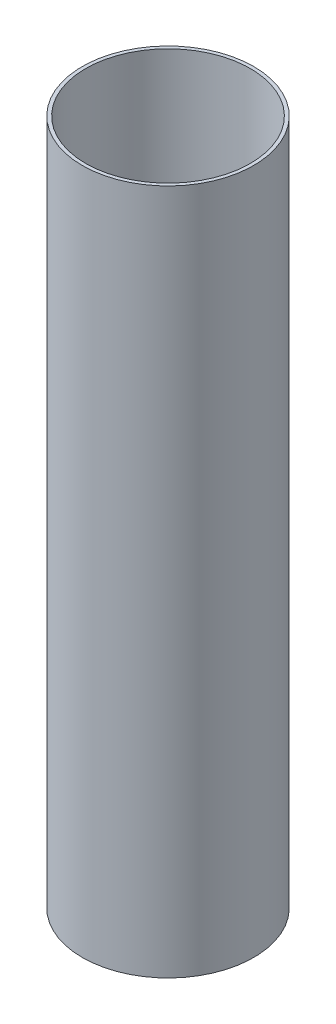
ISO-10303-21;
HEADER;
FILE_DESCRIPTION(('STEP AP214'),'2;1');
FILE_NAME('part.step','',(''),(''),'','','');
FILE_SCHEMA(('AUTOMOTIVE_DESIGN { 1 0 10303 214 1 1 1 1 }'));
ENDSEC;
DATA;
#1=APPLICATION_CONTEXT('core data for automotive mechanical design processes');
#2=APPLICATION_PROTOCOL_DEFINITION('international standard','automotive_design',2000,#1);
#3=PRODUCT_CONTEXT('',#1,'mechanical');
#4=PRODUCT('Part','Part','',(#3));
#5=PRODUCT_RELATED_PRODUCT_CATEGORY('part','',(#4));
#6=PRODUCT_DEFINITION_FORMATION('','',#4);
#7=PRODUCT_DEFINITION_CONTEXT('part definition',#1,'design');
#8=PRODUCT_DEFINITION('design','',#6,#7);
#9=PRODUCT_DEFINITION_SHAPE('','',#8);
#10=(LENGTH_UNIT() NAMED_UNIT(*) SI_UNIT(.MILLI.,.METRE.));
#11=(NAMED_UNIT(*) PLANE_ANGLE_UNIT() SI_UNIT($,.RADIAN.));
#12=(NAMED_UNIT(*) SI_UNIT($,.STERADIAN.) SOLID_ANGLE_UNIT());
#13=UNCERTAINTY_MEASURE_WITH_UNIT(LENGTH_MEASURE(1.E-05),#10,'distance_accuracy_value','');
#14=(GEOMETRIC_REPRESENTATION_CONTEXT(3) GLOBAL_UNCERTAINTY_ASSIGNED_CONTEXT((#13)) GLOBAL_UNIT_ASSIGNED_CONTEXT((#10,
#11,#12)) REPRESENTATION_CONTEXT('',''));
#15=CARTESIAN_POINT('',(0.,0.,0.));
#16=DIRECTION('',(0.,0.,1.));
#17=DIRECTION('',(1.,0.,0.));
#18=AXIS2_PLACEMENT_3D('',#15,#16,#17);
#19=CARTESIAN_POINT('',(0.,400.,0.));
#20=DIRECTION('',(0.,1.,0.));
#21=DIRECTION('',(0.,0.,1.));
#22=AXIS2_PLACEMENT_3D('',#19,#20,#21);
#23=PLANE('',#22);
#24=CARTESIAN_POINT('',(0.,400.,0.));
#25=DIRECTION('',(0.,1.,0.));
#26=DIRECTION('',(0.,0.,1.));
#27=AXIS2_PLACEMENT_3D('',#24,#25,#26);
#28=CIRCLE('',#27,50.);
#29=CARTESIAN_POINT('',(0.,400.,50.));
#30=VERTEX_POINT('',#29);
#31=EDGE_CURVE('E10',#30,#30,#28,.T.);
#32=ORIENTED_EDGE('',*,*,#31,.T.);
#33=EDGE_LOOP('',(#32));
#34=FACE_BOUND('',#33,.T.);
#35=CARTESIAN_POINT('',(0.,400.,0.));
#36=DIRECTION('',(0.,1.,0.));
#37=DIRECTION('',(0.,0.,1.));
#38=AXIS2_PLACEMENT_3D('',#35,#36,#37);
#39=CIRCLE('',#38,48.);
#40=CARTESIAN_POINT('',(0.,400.,48.));
#41=VERTEX_POINT('',#40);
#42=EDGE_CURVE('E51',#41,#41,#39,.T.);
#43=ORIENTED_EDGE('',*,*,#42,.F.);
#44=EDGE_LOOP('',(#43));
#45=FACE_BOUND('',#44,.T.);
#46=ADVANCED_FACE('F38',(#34,#45),#23,.T.);
#47=CARTESIAN_POINT('',(0.,0.,0.));
#48=DIRECTION('',(0.,1.,0.));
#49=DIRECTION('',(0.,0.,1.));
#50=AXIS2_PLACEMENT_3D('',#47,#48,#49);
#51=PLANE('',#50);
#52=CARTESIAN_POINT('',(0.,0.,0.));
#53=DIRECTION('',(0.,1.,0.));
#54=DIRECTION('',(0.,0.,1.));
#55=AXIS2_PLACEMENT_3D('',#52,#53,#54);
#56=CIRCLE('',#55,50.);
#57=CARTESIAN_POINT('',(0.,0.,50.));
#58=VERTEX_POINT('',#57);
#59=EDGE_CURVE('E42',#58,#58,#56,.T.);
#60=ORIENTED_EDGE('',*,*,#59,.F.);
#61=EDGE_LOOP('',(#60));
#62=FACE_BOUND('',#61,.T.);
#63=CARTESIAN_POINT('',(0.,0.,0.));
#64=DIRECTION('',(0.,1.,0.));
#65=DIRECTION('',(0.,0.,1.));
#66=AXIS2_PLACEMENT_3D('',#63,#64,#65);
#67=CIRCLE('',#66,48.);
#68=CARTESIAN_POINT('',(0.,0.,48.));
#69=VERTEX_POINT('',#68);
#70=EDGE_CURVE('E53',#69,#69,#67,.T.);
#71=ORIENTED_EDGE('',*,*,#70,.T.);
#72=EDGE_LOOP('',(#71));
#73=FACE_BOUND('',#72,.T.);
#74=ADVANCED_FACE('F63',(#62,#73),#51,.F.);
#75=CARTESIAN_POINT('',(0.,400.,0.));
#76=DIRECTION('',(0.,-1.,0.));
#77=DIRECTION('',(0.,0.,-1.));
#78=AXIS2_PLACEMENT_3D('',#75,#76,#77);
#79=CYLINDRICAL_SURFACE('',#78,50.);
#80=ORIENTED_EDGE('',*,*,#31,.F.);
#81=EDGE_LOOP('',(#80));
#82=FACE_BOUND('',#81,.T.);
#83=ORIENTED_EDGE('',*,*,#59,.T.);
#84=EDGE_LOOP('',(#83));
#85=FACE_BOUND('',#84,.T.);
#86=ADVANCED_FACE('F40',(#82,#85),#79,.T.);
#87=CARTESIAN_POINT('',(0.,400.,0.));
#88=DIRECTION('',(0.,-1.,0.));
#89=DIRECTION('',(0.,0.,-1.));
#90=AXIS2_PLACEMENT_3D('',#87,#88,#89);
#91=CYLINDRICAL_SURFACE('',#90,48.);
#92=ORIENTED_EDGE('',*,*,#42,.T.);
#93=EDGE_LOOP('',(#92));
#94=FACE_BOUND('',#93,.T.);
#95=ORIENTED_EDGE('',*,*,#70,.F.);
#96=EDGE_LOOP('',(#95));
#97=FACE_BOUND('',#96,.T.);
#98=ADVANCED_FACE('F59',(#94,#97),#91,.F.);
#99=CLOSED_SHELL('',(#46,#74,#86,#98));
#100=MANIFOLD_SOLID_BREP('B2',#99);
#101=ADVANCED_BREP_SHAPE_REPRESENTATION('',(#18,#100),#14);
#102=SHAPE_DEFINITION_REPRESENTATION(#9,#101);
ENDSEC;
END-ISO-10303-21;
